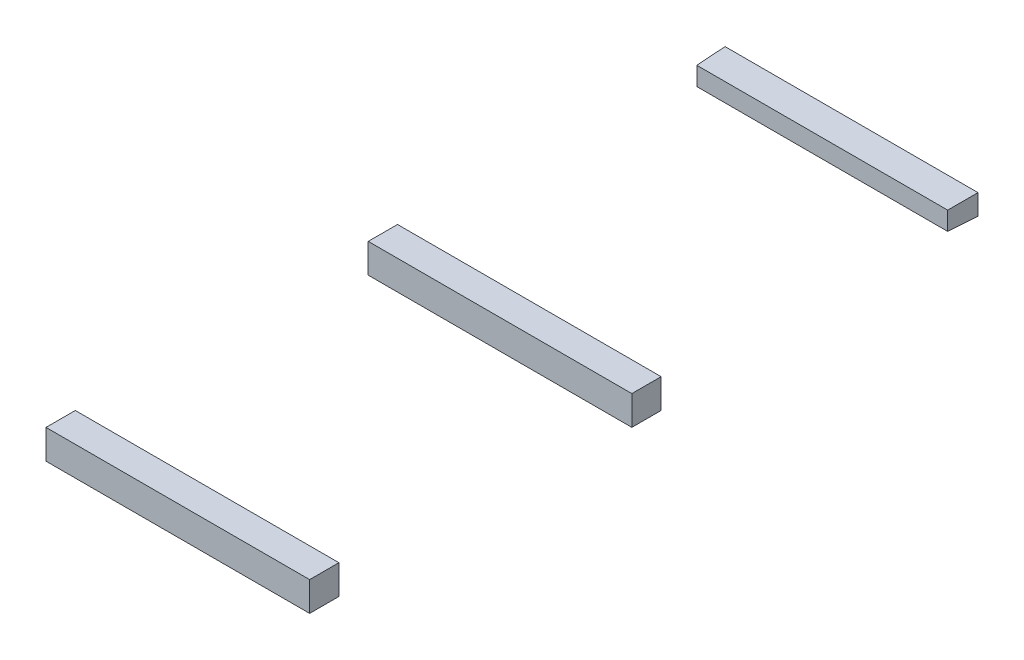
ISO-10303-21;
HEADER;
FILE_DESCRIPTION(('STEP AP214'),'2;1');
FILE_NAME('part.step','',(''),(''),'','','');
FILE_SCHEMA(('AUTOMOTIVE_DESIGN { 1 0 10303 214 1 1 1 1 }'));
ENDSEC;
DATA;
#1=APPLICATION_CONTEXT('core data for automotive mechanical design processes');
#2=APPLICATION_PROTOCOL_DEFINITION('international standard','automotive_design',2000,#1);
#3=PRODUCT_CONTEXT('',#1,'mechanical');
#4=PRODUCT('Part','Part','',(#3));
#5=PRODUCT_RELATED_PRODUCT_CATEGORY('part','',(#4));
#6=PRODUCT_DEFINITION_FORMATION('','',#4);
#7=PRODUCT_DEFINITION_CONTEXT('part definition',#1,'design');
#8=PRODUCT_DEFINITION('design','',#6,#7);
#9=PRODUCT_DEFINITION_SHAPE('','',#8);
#10=(LENGTH_UNIT() NAMED_UNIT(*) SI_UNIT(.MILLI.,.METRE.));
#11=(NAMED_UNIT(*) PLANE_ANGLE_UNIT() SI_UNIT($,.RADIAN.));
#12=(NAMED_UNIT(*) SI_UNIT($,.STERADIAN.) SOLID_ANGLE_UNIT());
#13=UNCERTAINTY_MEASURE_WITH_UNIT(LENGTH_MEASURE(1.E-05),#10,'distance_accuracy_value','');
#14=(GEOMETRIC_REPRESENTATION_CONTEXT(3) GLOBAL_UNCERTAINTY_ASSIGNED_CONTEXT((#13)) GLOBAL_UNIT_ASSIGNED_CONTEXT((#10,
#11,#12)) REPRESENTATION_CONTEXT('',''));
#15=CARTESIAN_POINT('',(0.,0.,0.));
#16=DIRECTION('',(0.,0.,1.));
#17=DIRECTION('',(1.,0.,0.));
#18=AXIS2_PLACEMENT_3D('',#15,#16,#17);
#19=CARTESIAN_POINT('',(45.,-8.50000000000002,220.));
#20=DIRECTION('',(0.,-1.,0.));
#21=DIRECTION('',(0.,0.,-1.));
#22=AXIS2_PLACEMENT_3D('',#19,#20,#21);
#23=PLANE('',#22);
#24=DIRECTION('',(0.,0.,1.));
#25=VECTOR('',#24,1.);
#26=CARTESIAN_POINT('',(-45.,-8.50000000000002,220.));
#27=LINE('',#26,#25);
#28=CARTESIAN_POINT('',(-45.,-8.50000000000002,220.));
#29=VERTEX_POINT('',#28);
#30=CARTESIAN_POINT('',(-45.,-8.50000000000003,230.));
#31=VERTEX_POINT('',#30);
#32=EDGE_CURVE('E12',#29,#31,#27,.T.);
#33=ORIENTED_EDGE('',*,*,#32,.F.);
#34=DIRECTION('',(-1.,0.,0.));
#35=VECTOR('',#34,1.);
#36=CARTESIAN_POINT('',(45.,-8.50000000000002,220.));
#37=LINE('',#36,#35);
#38=CARTESIAN_POINT('',(45.,-8.50000000000002,220.));
#39=VERTEX_POINT('',#38);
#40=EDGE_CURVE('E102',#39,#29,#37,.T.);
#41=ORIENTED_EDGE('',*,*,#40,.F.);
#42=DIRECTION('',(0.,0.,1.));
#43=VECTOR('',#42,1.);
#44=CARTESIAN_POINT('',(45.,-8.50000000000002,220.));
#45=LINE('',#44,#43);
#46=CARTESIAN_POINT('',(45.,-8.50000000000003,230.));
#47=VERTEX_POINT('',#46);
#48=EDGE_CURVE('E58',#39,#47,#45,.T.);
#49=ORIENTED_EDGE('',*,*,#48,.T.);
#50=DIRECTION('',(-1.,0.,0.));
#51=VECTOR('',#50,1.);
#52=CARTESIAN_POINT('',(45.,-8.50000000000003,230.));
#53=LINE('',#52,#51);
#54=EDGE_CURVE('E73',#47,#31,#53,.T.);
#55=ORIENTED_EDGE('',*,*,#54,.T.);
#56=EDGE_LOOP('',(#33,#41,#49,#55));
#57=FACE_BOUND('',#56,.T.);
#58=ADVANCED_FACE('F54',(#57),#23,.T.);
#59=CARTESIAN_POINT('',(45.,1.49999999999998,220.));
#60=DIRECTION('',(0.,0.,-1.));
#61=DIRECTION('',(-1.,0.,0.));
#62=AXIS2_PLACEMENT_3D('',#59,#60,#61);
#63=PLANE('',#62);
#64=DIRECTION('',(0.,-1.,0.));
#65=VECTOR('',#64,1.);
#66=CARTESIAN_POINT('',(-45.,1.49999999999998,220.));
#67=LINE('',#66,#65);
#68=CARTESIAN_POINT('',(-45.,1.49999999999998,220.));
#69=VERTEX_POINT('',#68);
#70=EDGE_CURVE('E116',#69,#29,#67,.T.);
#71=ORIENTED_EDGE('',*,*,#70,.F.);
#72=DIRECTION('',(-1.,0.,0.));
#73=VECTOR('',#72,1.);
#74=CARTESIAN_POINT('',(45.,1.49999999999998,220.));
#75=LINE('',#74,#73);
#76=CARTESIAN_POINT('',(45.,1.49999999999998,220.));
#77=VERTEX_POINT('',#76);
#78=EDGE_CURVE('E105',#77,#69,#75,.T.);
#79=ORIENTED_EDGE('',*,*,#78,.F.);
#80=DIRECTION('',(0.,-1.,0.));
#81=VECTOR('',#80,1.);
#82=CARTESIAN_POINT('',(45.,1.49999999999998,220.));
#83=LINE('',#82,#81);
#84=EDGE_CURVE('E123',#77,#39,#83,.T.);
#85=ORIENTED_EDGE('',*,*,#84,.T.);
#86=ORIENTED_EDGE('',*,*,#40,.T.);
#87=EDGE_LOOP('',(#71,#79,#85,#86));
#88=FACE_BOUND('',#87,.T.);
#89=ADVANCED_FACE('F118',(#88),#63,.T.);
#90=CARTESIAN_POINT('',(45.,1.49999999999998,220.));
#91=DIRECTION('',(0.,-1.,0.));
#92=DIRECTION('',(0.,0.,-1.));
#93=AXIS2_PLACEMENT_3D('',#90,#91,#92);
#94=PLANE('',#93);
#95=DIRECTION('',(0.,0.,1.));
#96=VECTOR('',#95,1.);
#97=CARTESIAN_POINT('',(-45.,1.49999999999998,220.));
#98=LINE('',#97,#96);
#99=CARTESIAN_POINT('',(-45.,1.49999999999998,230.));
#100=VERTEX_POINT('',#99);
#101=EDGE_CURVE('E108',#69,#100,#98,.T.);
#102=ORIENTED_EDGE('',*,*,#101,.T.);
#103=DIRECTION('',(-1.,0.,0.));
#104=VECTOR('',#103,1.);
#105=CARTESIAN_POINT('',(45.,1.49999999999998,230.));
#106=LINE('',#105,#104);
#107=CARTESIAN_POINT('',(45.,1.49999999999998,230.));
#108=VERTEX_POINT('',#107);
#109=EDGE_CURVE('E110',#108,#100,#106,.T.);
#110=ORIENTED_EDGE('',*,*,#109,.F.);
#111=DIRECTION('',(0.,0.,1.));
#112=VECTOR('',#111,1.);
#113=CARTESIAN_POINT('',(45.,1.49999999999998,220.));
#114=LINE('',#113,#112);
#115=EDGE_CURVE('E91',#77,#108,#114,.T.);
#116=ORIENTED_EDGE('',*,*,#115,.F.);
#117=ORIENTED_EDGE('',*,*,#78,.T.);
#118=EDGE_LOOP('',(#102,#110,#116,#117));
#119=FACE_BOUND('',#118,.T.);
#120=ADVANCED_FACE('F107',(#119),#94,.F.);
#121=CARTESIAN_POINT('',(45.,1.49999999999998,230.));
#122=DIRECTION('',(0.,0.,-1.));
#123=DIRECTION('',(-1.,0.,0.));
#124=AXIS2_PLACEMENT_3D('',#121,#122,#123);
#125=PLANE('',#124);
#126=DIRECTION('',(0.,-1.,0.));
#127=VECTOR('',#126,1.);
#128=CARTESIAN_POINT('',(-45.,1.49999999999998,230.));
#129=LINE('',#128,#127);
#130=EDGE_CURVE('E64',#100,#31,#129,.T.);
#131=ORIENTED_EDGE('',*,*,#130,.T.);
#132=ORIENTED_EDGE('',*,*,#54,.F.);
#133=DIRECTION('',(0.,-1.,0.));
#134=VECTOR('',#133,1.);
#135=CARTESIAN_POINT('',(45.,1.49999999999998,230.));
#136=LINE('',#135,#134);
#137=EDGE_CURVE('E96',#108,#47,#136,.T.);
#138=ORIENTED_EDGE('',*,*,#137,.F.);
#139=ORIENTED_EDGE('',*,*,#109,.T.);
#140=EDGE_LOOP('',(#131,#132,#138,#139));
#141=FACE_BOUND('',#140,.T.);
#142=ADVANCED_FACE('F128',(#141),#125,.F.);
#143=CARTESIAN_POINT('',(45.,0.,0.));
#144=DIRECTION('',(1.,0.,0.));
#145=DIRECTION('',(0.,0.,-1.));
#146=AXIS2_PLACEMENT_3D('',#143,#144,#145);
#147=PLANE('',#146);
#148=ORIENTED_EDGE('',*,*,#48,.F.);
#149=ORIENTED_EDGE('',*,*,#84,.F.);
#150=ORIENTED_EDGE('',*,*,#115,.T.);
#151=ORIENTED_EDGE('',*,*,#137,.T.);
#152=EDGE_LOOP('',(#148,#149,#150,#151));
#153=FACE_BOUND('',#152,.T.);
#154=ADVANCED_FACE('F56',(#153),#147,.T.);
#155=CARTESIAN_POINT('',(-45.,0.,0.));
#156=DIRECTION('',(1.,0.,0.));
#157=DIRECTION('',(0.,0.,-1.));
#158=AXIS2_PLACEMENT_3D('',#155,#156,#157);
#159=PLANE('',#158);
#160=ORIENTED_EDGE('',*,*,#32,.T.);
#161=ORIENTED_EDGE('',*,*,#130,.F.);
#162=ORIENTED_EDGE('',*,*,#101,.F.);
#163=ORIENTED_EDGE('',*,*,#70,.T.);
#164=EDGE_LOOP('',(#160,#161,#162,#163));
#165=FACE_BOUND('',#164,.T.);
#166=ADVANCED_FACE('F115',(#165),#159,.F.);
#167=CLOSED_SHELL('',(#58,#89,#120,#142,#154,#166));
#168=MANIFOLD_SOLID_BREP('B2',#167);
#169=CARTESIAN_POINT('',(45.,1.50000000000009,0.));
#170=DIRECTION('',(0.,-1.,0.));
#171=DIRECTION('',(0.,0.,-1.));
#172=AXIS2_PLACEMENT_3D('',#169,#170,#171);
#173=PLANE('',#172);
#174=DIRECTION('',(0.,0.,1.));
#175=VECTOR('',#174,1.);
#176=CARTESIAN_POINT('',(-45.,1.50000000000009,0.));
#177=LINE('',#176,#175);
#178=CARTESIAN_POINT('',(-45.,1.49999999999999,110.));
#179=VERTEX_POINT('',#178);
#180=CARTESIAN_POINT('',(-45.,1.49999999999998,120.));
#181=VERTEX_POINT('',#180);
#182=EDGE_CURVE('E249',#179,#181,#177,.T.);
#183=ORIENTED_EDGE('',*,*,#182,.T.);
#184=DIRECTION('',(-1.,0.,0.));
#185=VECTOR('',#184,1.);
#186=CARTESIAN_POINT('',(45.,1.49999999999998,120.));
#187=LINE('',#186,#185);
#188=CARTESIAN_POINT('',(45.,1.49999999999998,120.));
#189=VERTEX_POINT('',#188);
#190=EDGE_CURVE('E52',#189,#181,#187,.T.);
#191=ORIENTED_EDGE('',*,*,#190,.F.);
#192=DIRECTION('',(0.,0.,1.));
#193=VECTOR('',#192,1.);
#194=CARTESIAN_POINT('',(45.,1.50000000000009,0.));
#195=LINE('',#194,#193);
#196=CARTESIAN_POINT('',(45.,1.49999999999999,110.));
#197=VERTEX_POINT('',#196);
#198=EDGE_CURVE('E234',#197,#189,#195,.T.);
#199=ORIENTED_EDGE('',*,*,#198,.F.);
#200=DIRECTION('',(-1.,0.,0.));
#201=VECTOR('',#200,1.);
#202=CARTESIAN_POINT('',(45.,1.49999999999999,110.));
#203=LINE('',#202,#201);
#204=EDGE_CURVE('E245',#197,#179,#203,.T.);
#205=ORIENTED_EDGE('',*,*,#204,.T.);
#206=EDGE_LOOP('',(#183,#191,#199,#205));
#207=FACE_BOUND('',#206,.T.);
#208=ADVANCED_FACE('F187',(#207),#173,.F.);
#209=CARTESIAN_POINT('',(45.,0.,120.));
#210=DIRECTION('',(0.,0.,-1.));
#211=DIRECTION('',(-1.,0.,0.));
#212=AXIS2_PLACEMENT_3D('',#209,#210,#211);
#213=PLANE('',#212);
#214=DIRECTION('',(0.,-1.,0.));
#215=VECTOR('',#214,1.);
#216=CARTESIAN_POINT('',(-45.,0.,120.));
#217=LINE('',#216,#215);
#218=CARTESIAN_POINT('',(-45.,-8.50000000000001,120.));
#219=VERTEX_POINT('',#218);
#220=EDGE_CURVE('E239',#181,#219,#217,.T.);
#221=ORIENTED_EDGE('',*,*,#220,.T.);
#222=DIRECTION('',(-1.,0.,0.));
#223=VECTOR('',#222,1.);
#224=CARTESIAN_POINT('',(45.,-8.50000000000001,120.));
#225=LINE('',#224,#223);
#226=CARTESIAN_POINT('',(45.,-8.50000000000001,120.));
#227=VERTEX_POINT('',#226);
#228=EDGE_CURVE('E195',#227,#219,#225,.T.);
#229=ORIENTED_EDGE('',*,*,#228,.F.);
#230=DIRECTION('',(0.,-1.,0.));
#231=VECTOR('',#230,1.);
#232=CARTESIAN_POINT('',(45.,0.,120.));
#233=LINE('',#232,#231);
#234=EDGE_CURVE('E229',#189,#227,#233,.T.);
#235=ORIENTED_EDGE('',*,*,#234,.F.);
#236=ORIENTED_EDGE('',*,*,#190,.T.);
#237=EDGE_LOOP('',(#221,#229,#235,#236));
#238=FACE_BOUND('',#237,.T.);
#239=ADVANCED_FACE('F238',(#238),#213,.F.);
#240=CARTESIAN_POINT('',(45.,-8.49999999999999,0.));
#241=DIRECTION('',(0.,-1.,0.));
#242=DIRECTION('',(0.,0.,-1.));
#243=AXIS2_PLACEMENT_3D('',#240,#241,#242);
#244=PLANE('',#243);
#245=DIRECTION('',(0.,0.,1.));
#246=VECTOR('',#245,1.);
#247=CARTESIAN_POINT('',(-45.,-8.49999999999999,0.));
#248=LINE('',#247,#246);
#249=CARTESIAN_POINT('',(-45.,-8.50000000000001,110.));
#250=VERTEX_POINT('',#249);
#251=EDGE_CURVE('E253',#250,#219,#248,.T.);
#252=ORIENTED_EDGE('',*,*,#251,.F.);
#253=DIRECTION('',(-1.,0.,0.));
#254=VECTOR('',#253,1.);
#255=CARTESIAN_POINT('',(45.,-8.50000000000001,110.));
#256=LINE('',#255,#254);
#257=CARTESIAN_POINT('',(45.,-8.50000000000001,110.));
#258=VERTEX_POINT('',#257);
#259=EDGE_CURVE('E219',#258,#250,#256,.T.);
#260=ORIENTED_EDGE('',*,*,#259,.F.);
#261=DIRECTION('',(0.,0.,1.));
#262=VECTOR('',#261,1.);
#263=CARTESIAN_POINT('',(45.,-8.49999999999999,0.));
#264=LINE('',#263,#262);
#265=EDGE_CURVE('E232',#258,#227,#264,.T.);
#266=ORIENTED_EDGE('',*,*,#265,.T.);
#267=ORIENTED_EDGE('',*,*,#228,.T.);
#268=EDGE_LOOP('',(#252,#260,#266,#267));
#269=FACE_BOUND('',#268,.T.);
#270=ADVANCED_FACE('F243',(#269),#244,.T.);
#271=CARTESIAN_POINT('',(45.,0.,110.));
#272=DIRECTION('',(0.,0.,1.));
#273=DIRECTION('',(1.,0.,0.));
#274=AXIS2_PLACEMENT_3D('',#271,#272,#273);
#275=PLANE('',#274);
#276=DIRECTION('',(0.,1.,0.));
#277=VECTOR('',#276,1.);
#278=CARTESIAN_POINT('',(-45.,0.,110.));
#279=LINE('',#278,#277);
#280=EDGE_CURVE('E222',#250,#179,#279,.T.);
#281=ORIENTED_EDGE('',*,*,#280,.T.);
#282=ORIENTED_EDGE('',*,*,#204,.F.);
#283=DIRECTION('',(0.,1.,0.));
#284=VECTOR('',#283,1.);
#285=CARTESIAN_POINT('',(45.,0.,110.));
#286=LINE('',#285,#284);
#287=EDGE_CURVE('E203',#258,#197,#286,.T.);
#288=ORIENTED_EDGE('',*,*,#287,.F.);
#289=ORIENTED_EDGE('',*,*,#259,.T.);
#290=EDGE_LOOP('',(#281,#282,#288,#289));
#291=FACE_BOUND('',#290,.T.);
#292=ADVANCED_FACE('F266',(#291),#275,.F.);
#293=CARTESIAN_POINT('',(45.,0.,0.));
#294=DIRECTION('',(1.,0.,0.));
#295=DIRECTION('',(0.,0.,-1.));
#296=AXIS2_PLACEMENT_3D('',#293,#294,#295);
#297=PLANE('',#296);
#298=ORIENTED_EDGE('',*,*,#198,.T.);
#299=ORIENTED_EDGE('',*,*,#234,.T.);
#300=ORIENTED_EDGE('',*,*,#265,.F.);
#301=ORIENTED_EDGE('',*,*,#287,.T.);
#302=EDGE_LOOP('',(#298,#299,#300,#301));
#303=FACE_BOUND('',#302,.T.);
#304=ADVANCED_FACE('F230',(#303),#297,.T.);
#305=CARTESIAN_POINT('',(-45.,0.,0.));
#306=DIRECTION('',(1.,0.,0.));
#307=DIRECTION('',(0.,0.,-1.));
#308=AXIS2_PLACEMENT_3D('',#305,#306,#307);
#309=PLANE('',#308);
#310=ORIENTED_EDGE('',*,*,#182,.F.);
#311=ORIENTED_EDGE('',*,*,#280,.F.);
#312=ORIENTED_EDGE('',*,*,#251,.T.);
#313=ORIENTED_EDGE('',*,*,#220,.F.);
#314=EDGE_LOOP('',(#310,#311,#312,#313));
#315=FACE_BOUND('',#314,.T.);
#316=ADVANCED_FACE('F260',(#315),#309,.F.);
#317=CLOSED_SHELL('',(#208,#239,#270,#292,#304,#316));
#318=MANIFOLD_SOLID_BREP('B6',#317);
#319=CARTESIAN_POINT('',(43.175,0.,0.));
#320=DIRECTION('',(0.999390827019096,0.,0.034899496702501));
#321=DIRECTION('',(0.034899496702501,0.,-0.999390827019096));
#322=AXIS2_PLACEMENT_3D('',#319,#320,#321);
#323=PLANE('',#322);
#324=DIRECTION('',(0.,1.,0.));
#325=VECTOR('',#324,1.);
#326=CARTESIAN_POINT('',(43.175,0.,0.));
#327=LINE('',#326,#325);
#328=CARTESIAN_POINT('',(43.175,-6.99999999999999,0.));
#329=VERTEX_POINT('',#328);
#330=CARTESIAN_POINT('',(43.175,0.,0.));
#331=VERTEX_POINT('',#330);
#332=EDGE_CURVE('E359',#329,#331,#327,.T.);
#333=ORIENTED_EDGE('',*,*,#332,.T.);
#334=DIRECTION('',(0.0348782627423747,0.0348782627423747,-0.998782765958718));
#335=VECTOR('',#334,1.);
#336=CARTESIAN_POINT('',(43.0699558111502,-0.10504418884982,3.00807199780187));
#337=LINE('',#336,#335);
#338=CARTESIAN_POINT('',(42.8257923050825,-0.349207694917478,10.));
#339=VERTEX_POINT('',#338);
#340=EDGE_CURVE('E185',#339,#331,#337,.T.);
#341=ORIENTED_EDGE('',*,*,#340,.F.);
#342=DIRECTION('',(0.,-1.,0.));
#343=VECTOR('',#342,1.);
#344=CARTESIAN_POINT('',(42.8257923050825,0.,10.));
#345=LINE('',#344,#343);
#346=CARTESIAN_POINT('',(42.8257923050825,-6.65079230508252,10.));
#347=VERTEX_POINT('',#346);
#348=EDGE_CURVE('E375',#347,#339,#345,.F.);
#349=ORIENTED_EDGE('',*,*,#348,.F.);
#350=DIRECTION('',(0.0348782627423747,-0.0348782627423747,-0.998782765958718));
#351=VECTOR('',#350,1.);
#352=CARTESIAN_POINT('',(43.1664845475165,-6.99148454751651,0.243850654135647));
#353=LINE('',#352,#351);
#354=EDGE_CURVE('E370',#347,#329,#353,.T.);
#355=ORIENTED_EDGE('',*,*,#354,.T.);
#356=EDGE_LOOP('',(#333,#341,#349,#355));
#357=FACE_BOUND('',#356,.T.);
#358=ADVANCED_FACE('F313',(#357),#323,.T.);
#359=CARTESIAN_POINT('',(-43.175,0.,0.));
#360=DIRECTION('',(0.,0.999390827019096,0.034899496702501));
#361=DIRECTION('',(0.,-0.034899496702501,0.999390827019096));
#362=AXIS2_PLACEMENT_3D('',#359,#360,#361);
#363=PLANE('',#362);
#364=DIRECTION('',(-1.,0.,0.));
#365=VECTOR('',#364,1.);
#366=CARTESIAN_POINT('',(-43.175,0.,0.));
#367=LINE('',#366,#365);
#368=CARTESIAN_POINT('',(-43.175,0.,0.));
#369=VERTEX_POINT('',#368);
#370=EDGE_CURVE('E355',#331,#369,#367,.T.);
#371=ORIENTED_EDGE('',*,*,#370,.T.);
#372=DIRECTION('',(-0.0348782627423747,0.0348782627423747,-0.998782765958718));
#373=VECTOR('',#372,1.);
#374=CARTESIAN_POINT('',(-43.1664845475165,-0.00851545248348358,0.243850654135647));
#375=LINE('',#374,#373);
#376=CARTESIAN_POINT('',(-42.8257923050825,-0.349207694917478,10.));
#377=VERTEX_POINT('',#376);
#378=EDGE_CURVE('E322',#377,#369,#375,.T.);
#379=ORIENTED_EDGE('',*,*,#378,.F.);
#380=DIRECTION('',(1.,0.,0.));
#381=VECTOR('',#380,1.);
#382=CARTESIAN_POINT('',(0.,-0.349207694917478,10.));
#383=LINE('',#382,#381);
#384=EDGE_CURVE('E366',#339,#377,#383,.F.);
#385=ORIENTED_EDGE('',*,*,#384,.F.);
#386=ORIENTED_EDGE('',*,*,#340,.T.);
#387=EDGE_LOOP('',(#371,#379,#385,#386));
#388=FACE_BOUND('',#387,.T.);
#389=ADVANCED_FACE('F315',(#388),#363,.T.);
#390=CARTESIAN_POINT('',(-43.175,-7.00000000000001,0.));
#391=DIRECTION('',(-0.999390827019096,0.,0.034899496702501));
#392=DIRECTION('',(0.034899496702501,0.,0.999390827019096));
#393=AXIS2_PLACEMENT_3D('',#390,#391,#392);
#394=PLANE('',#393);
#395=DIRECTION('',(0.,-1.,0.));
#396=VECTOR('',#395,1.);
#397=CARTESIAN_POINT('',(-43.175,-7.00000000000001,0.));
#398=LINE('',#397,#396);
#399=CARTESIAN_POINT('',(-43.175,-7.00000000000001,0.));
#400=VERTEX_POINT('',#399);
#401=EDGE_CURVE('E360',#369,#400,#398,.T.);
#402=ORIENTED_EDGE('',*,*,#401,.T.);
#403=DIRECTION('',(-0.0348782627423747,-0.0348782627423747,-0.998782765958718));
#404=VECTOR('',#403,1.);
#405=CARTESIAN_POINT('',(-43.0699558111502,-6.89495581115019,3.00807199780188));
#406=LINE('',#405,#404);
#407=CARTESIAN_POINT('',(-42.8257923050825,-6.65079230508253,10.));
#408=VERTEX_POINT('',#407);
#409=EDGE_CURVE('E378',#408,#400,#406,.T.);
#410=ORIENTED_EDGE('',*,*,#409,.F.);
#411=DIRECTION('',(0.,1.,0.));
#412=VECTOR('',#411,1.);
#413=CARTESIAN_POINT('',(-42.8257923050825,0.,10.));
#414=LINE('',#413,#412);
#415=EDGE_CURVE('E334',#377,#408,#414,.F.);
#416=ORIENTED_EDGE('',*,*,#415,.F.);
#417=ORIENTED_EDGE('',*,*,#378,.T.);
#418=EDGE_LOOP('',(#402,#410,#416,#417));
#419=FACE_BOUND('',#418,.T.);
#420=ADVANCED_FACE('F385',(#419),#394,.T.);
#421=CARTESIAN_POINT('',(43.175,-6.99999999999999,0.));
#422=DIRECTION('',(0.,-0.999390827019096,0.034899496702501));
#423=DIRECTION('',(0.,-0.034899496702501,-0.999390827019096));
#424=AXIS2_PLACEMENT_3D('',#421,#422,#423);
#425=PLANE('',#424);
#426=DIRECTION('',(1.,0.,0.));
#427=VECTOR('',#426,1.);
#428=CARTESIAN_POINT('',(43.175,-6.99999999999999,0.));
#429=LINE('',#428,#427);
#430=EDGE_CURVE('E374',#400,#329,#429,.T.);
#431=ORIENTED_EDGE('',*,*,#430,.T.);
#432=ORIENTED_EDGE('',*,*,#354,.F.);
#433=DIRECTION('',(-1.,0.,0.));
#434=VECTOR('',#433,1.);
#435=CARTESIAN_POINT('',(0.,-6.65079230508252,10.));
#436=LINE('',#435,#434);
#437=EDGE_CURVE('E317',#408,#347,#436,.F.);
#438=ORIENTED_EDGE('',*,*,#437,.F.);
#439=ORIENTED_EDGE('',*,*,#409,.T.);
#440=EDGE_LOOP('',(#431,#432,#438,#439));
#441=FACE_BOUND('',#440,.T.);
#442=ADVANCED_FACE('F387',(#441),#425,.T.);
#443=CARTESIAN_POINT('',(0.,0.,10.));
#444=DIRECTION('',(0.,0.,-1.));
#445=DIRECTION('',(-1.,0.,0.));
#446=AXIS2_PLACEMENT_3D('',#443,#444,#445);
#447=PLANE('',#446);
#448=ORIENTED_EDGE('',*,*,#348,.T.);
#449=ORIENTED_EDGE('',*,*,#384,.T.);
#450=ORIENTED_EDGE('',*,*,#415,.T.);
#451=ORIENTED_EDGE('',*,*,#437,.T.);
#452=EDGE_LOOP('',(#448,#449,#450,#451));
#453=FACE_BOUND('',#452,.T.);
#454=ADVANCED_FACE('F383',(#453),#447,.F.);
#455=CARTESIAN_POINT('',(0.,0.,0.));
#456=DIRECTION('',(0.,0.,-1.));
#457=DIRECTION('',(-1.,0.,0.));
#458=AXIS2_PLACEMENT_3D('',#455,#456,#457);
#459=PLANE('',#458);
#460=ORIENTED_EDGE('',*,*,#332,.F.);
#461=ORIENTED_EDGE('',*,*,#430,.F.);
#462=ORIENTED_EDGE('',*,*,#401,.F.);
#463=ORIENTED_EDGE('',*,*,#370,.F.);
#464=EDGE_LOOP('',(#460,#461,#462,#463));
#465=FACE_BOUND('',#464,.T.);
#466=ADVANCED_FACE('F356',(#465),#459,.T.);
#467=CLOSED_SHELL('',(#358,#389,#420,#442,#454,#466));
#468=MANIFOLD_SOLID_BREP('B46',#467);
#469=ADVANCED_BREP_SHAPE_REPRESENTATION('',(#18,#168,#318,#468),#14);
#470=SHAPE_DEFINITION_REPRESENTATION(#9,#469);
ENDSEC;
END-ISO-10303-21;
